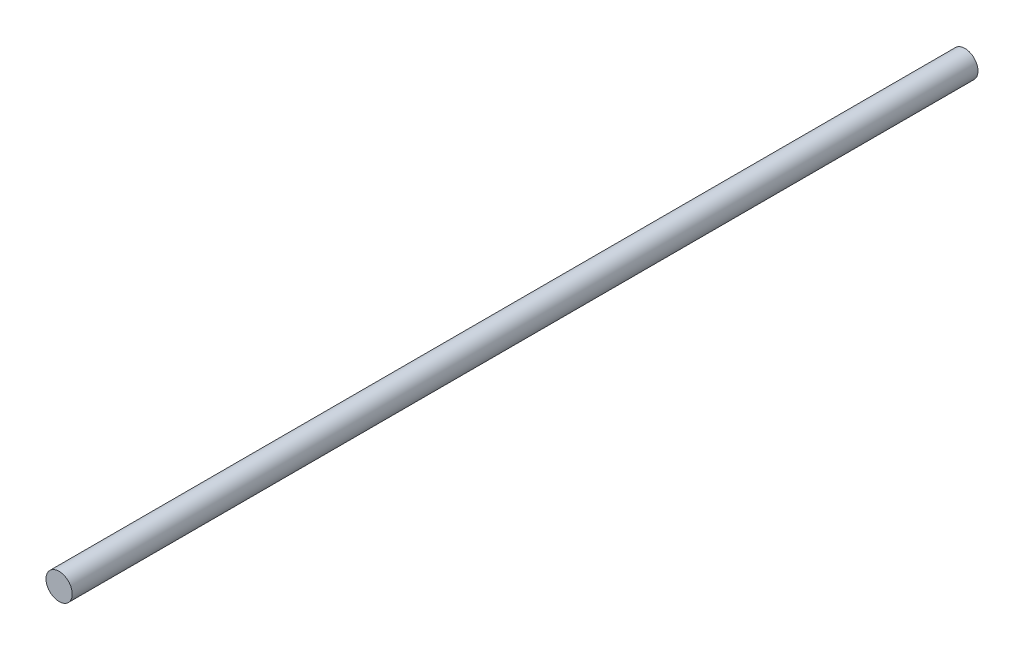
ISO-10303-21;
HEADER;
FILE_DESCRIPTION(('STEP AP214'),'2;1');
FILE_NAME('part.step','',(''),(''),'','','');
FILE_SCHEMA(('AUTOMOTIVE_DESIGN { 1 0 10303 214 1 1 1 1 }'));
ENDSEC;
DATA;
#1=APPLICATION_CONTEXT('core data for automotive mechanical design processes');
#2=APPLICATION_PROTOCOL_DEFINITION('international standard','automotive_design',2000,#1);
#3=PRODUCT_CONTEXT('',#1,'mechanical');
#4=PRODUCT('Part','Part','',(#3));
#5=PRODUCT_RELATED_PRODUCT_CATEGORY('part','',(#4));
#6=PRODUCT_DEFINITION_FORMATION('','',#4);
#7=PRODUCT_DEFINITION_CONTEXT('part definition',#1,'design');
#8=PRODUCT_DEFINITION('design','',#6,#7);
#9=PRODUCT_DEFINITION_SHAPE('','',#8);
#10=(LENGTH_UNIT() NAMED_UNIT(*) SI_UNIT(.MILLI.,.METRE.));
#11=(NAMED_UNIT(*) PLANE_ANGLE_UNIT() SI_UNIT($,.RADIAN.));
#12=(NAMED_UNIT(*) SI_UNIT($,.STERADIAN.) SOLID_ANGLE_UNIT());
#13=UNCERTAINTY_MEASURE_WITH_UNIT(LENGTH_MEASURE(1.E-05),#10,'distance_accuracy_value','');
#14=(GEOMETRIC_REPRESENTATION_CONTEXT(3) GLOBAL_UNCERTAINTY_ASSIGNED_CONTEXT((#13)) GLOBAL_UNIT_ASSIGNED_CONTEXT((#10,
#11,#12)) REPRESENTATION_CONTEXT('',''));
#15=CARTESIAN_POINT('',(0.,0.,0.));
#16=DIRECTION('',(0.,0.,1.));
#17=DIRECTION('',(1.,0.,0.));
#18=AXIS2_PLACEMENT_3D('',#15,#16,#17);
#19=CARTESIAN_POINT('',(0.,0.,-438.15));
#20=DIRECTION('',(0.,0.,1.));
#21=DIRECTION('',(-1.,0.,0.));
#22=AXIS2_PLACEMENT_3D('',#19,#20,#21);
#23=CYLINDRICAL_SURFACE('',#22,6.35);
#24=CARTESIAN_POINT('',(0.,0.,-438.15));
#25=DIRECTION('',(0.,0.,1.));
#26=DIRECTION('',(1.,0.,0.));
#27=AXIS2_PLACEMENT_3D('',#24,#25,#26);
#28=CIRCLE('',#27,6.35);
#29=CARTESIAN_POINT('',(6.35,0.,-438.15));
#30=VERTEX_POINT('',#29);
#31=EDGE_CURVE('E10',#30,#30,#28,.T.);
#32=ORIENTED_EDGE('',*,*,#31,.T.);
#33=EDGE_LOOP('',(#32));
#34=FACE_BOUND('',#33,.T.);
#35=CARTESIAN_POINT('',(0.,0.,0.));
#36=DIRECTION('',(0.,0.,1.));
#37=DIRECTION('',(1.,0.,0.));
#38=AXIS2_PLACEMENT_3D('',#35,#36,#37);
#39=CIRCLE('',#38,6.35);
#40=CARTESIAN_POINT('',(6.35,0.,0.));
#41=VERTEX_POINT('',#40);
#42=EDGE_CURVE('E38',#41,#41,#39,.T.);
#43=ORIENTED_EDGE('',*,*,#42,.F.);
#44=EDGE_LOOP('',(#43));
#45=FACE_BOUND('',#44,.T.);
#46=ADVANCED_FACE('F35',(#34,#45),#23,.T.);
#47=CARTESIAN_POINT('',(0.,0.,-438.15));
#48=DIRECTION('',(0.,0.,-1.));
#49=DIRECTION('',(1.,0.,0.));
#50=AXIS2_PLACEMENT_3D('',#47,#48,#49);
#51=PLANE('',#50);
#52=ORIENTED_EDGE('',*,*,#31,.F.);
#53=EDGE_LOOP('',(#52));
#54=FACE_BOUND('',#53,.T.);
#55=ADVANCED_FACE('F50',(#54),#51,.T.);
#56=CARTESIAN_POINT('',(0.,0.,0.));
#57=DIRECTION('',(0.,0.,-1.));
#58=DIRECTION('',(1.,0.,0.));
#59=AXIS2_PLACEMENT_3D('',#56,#57,#58);
#60=PLANE('',#59);
#61=ORIENTED_EDGE('',*,*,#42,.T.);
#62=EDGE_LOOP('',(#61));
#63=FACE_BOUND('',#62,.T.);
#64=ADVANCED_FACE('F47',(#63),#60,.F.);
#65=CLOSED_SHELL('',(#46,#55,#64));
#66=MANIFOLD_SOLID_BREP('B2',#65);
#67=ADVANCED_BREP_SHAPE_REPRESENTATION('',(#18,#66),#14);
#68=SHAPE_DEFINITION_REPRESENTATION(#9,#67);
ENDSEC;
END-ISO-10303-21;
